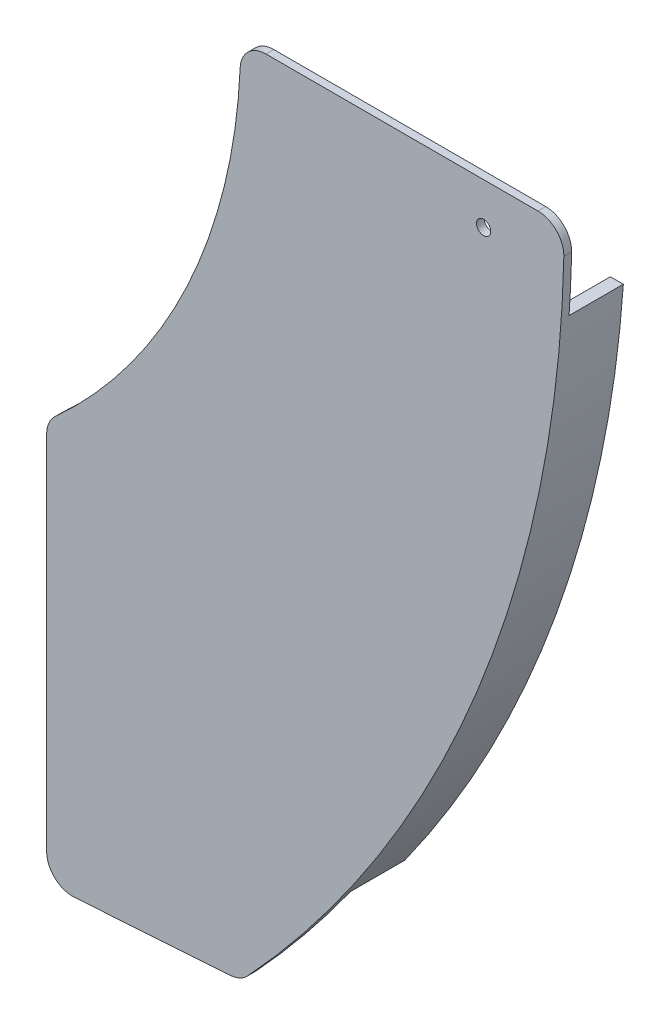
ISO-10303-21;
HEADER;
FILE_DESCRIPTION(('STEP AP214'),'2;1');
FILE_NAME('part.step','',(''),(''),'','','');
FILE_SCHEMA(('AUTOMOTIVE_DESIGN { 1 0 10303 214 1 1 1 1 }'));
ENDSEC;
DATA;
#1=APPLICATION_CONTEXT('core data for automotive mechanical design processes');
#2=APPLICATION_PROTOCOL_DEFINITION('international standard','automotive_design',2000,#1);
#3=PRODUCT_CONTEXT('',#1,'mechanical');
#4=PRODUCT('Part','Part','',(#3));
#5=PRODUCT_RELATED_PRODUCT_CATEGORY('part','',(#4));
#6=PRODUCT_DEFINITION_FORMATION('','',#4);
#7=PRODUCT_DEFINITION_CONTEXT('part definition',#1,'design');
#8=PRODUCT_DEFINITION('design','',#6,#7);
#9=PRODUCT_DEFINITION_SHAPE('','',#8);
#10=(LENGTH_UNIT() NAMED_UNIT(*) SI_UNIT(.MILLI.,.METRE.));
#11=(NAMED_UNIT(*) PLANE_ANGLE_UNIT() SI_UNIT($,.RADIAN.));
#12=(NAMED_UNIT(*) SI_UNIT($,.STERADIAN.) SOLID_ANGLE_UNIT());
#13=UNCERTAINTY_MEASURE_WITH_UNIT(LENGTH_MEASURE(1.E-05),#10,'distance_accuracy_value','');
#14=(GEOMETRIC_REPRESENTATION_CONTEXT(3) GLOBAL_UNCERTAINTY_ASSIGNED_CONTEXT((#13)) GLOBAL_UNIT_ASSIGNED_CONTEXT((#10,
#11,#12)) REPRESENTATION_CONTEXT('',''));
#15=CARTESIAN_POINT('',(0.,0.,0.));
#16=DIRECTION('',(0.,0.,1.));
#17=DIRECTION('',(1.,0.,0.));
#18=AXIS2_PLACEMENT_3D('',#15,#16,#17);
#19=CARTESIAN_POINT('',(114.888726767098,-10.,-1.25));
#20=DIRECTION('',(0.,0.,-1.));
#21=DIRECTION('',(1.,0.,0.));
#22=AXIS2_PLACEMENT_3D('',#19,#20,#21);
#23=CYLINDRICAL_SURFACE('',#22,10.);
#24=DIRECTION('',(0.,0.,-1.));
#25=VECTOR('',#24,1.);
#26=CARTESIAN_POINT('',(124.886250727202,-10.2225189141077,-1.25));
#27=LINE('',#26,#25);
#28=CARTESIAN_POINT('',(124.886250727202,-10.2225189141077,1.75));
#29=VERTEX_POINT('',#28);
#30=CARTESIAN_POINT('',(124.886250727202,-10.2225189141077,-1.25));
#31=VERTEX_POINT('',#30);
#32=EDGE_CURVE('E11',#29,#31,#27,.T.);
#33=ORIENTED_EDGE('',*,*,#32,.T.);
#34=CARTESIAN_POINT('',(114.888726767098,-10.,-1.25));
#35=DIRECTION('',(0.,0.,1.));
#36=DIRECTION('',(-1.,0.,0.));
#37=AXIS2_PLACEMENT_3D('',#34,#35,#36);
#38=CIRCLE('',#37,10.);
#39=CARTESIAN_POINT('',(114.888726767098,0.,-1.25));
#40=VERTEX_POINT('',#39);
#41=EDGE_CURVE('E180',#31,#40,#38,.T.);
#42=ORIENTED_EDGE('',*,*,#41,.T.);
#43=DIRECTION('',(0.,0.,-1.));
#44=VECTOR('',#43,1.);
#45=CARTESIAN_POINT('',(114.888726767098,0.,-1.25));
#46=LINE('',#45,#44);
#47=CARTESIAN_POINT('',(114.888726767098,0.,1.75));
#48=VERTEX_POINT('',#47);
#49=EDGE_CURVE('E48',#48,#40,#46,.T.);
#50=ORIENTED_EDGE('',*,*,#49,.F.);
#51=CARTESIAN_POINT('',(114.888726767098,-10.,1.75));
#52=DIRECTION('',(0.,0.,1.));
#53=DIRECTION('',(1.,0.,0.));
#54=AXIS2_PLACEMENT_3D('',#51,#52,#53);
#55=CIRCLE('',#54,10.);
#56=EDGE_CURVE('E230',#29,#48,#55,.T.);
#57=ORIENTED_EDGE('',*,*,#56,.F.);
#58=EDGE_LOOP('',(#33,#42,#50,#57));
#59=FACE_BOUND('',#58,.T.);
#60=ADVANCED_FACE('F39',(#59),#23,.T.);
#61=CARTESIAN_POINT('',(9.78155520058865,0.,-1.25));
#62=DIRECTION('',(0.,1.,0.));
#63=DIRECTION('',(-1.,0.,0.));
#64=AXIS2_PLACEMENT_3D('',#61,#62,#63);
#65=PLANE('',#64);
#66=ORIENTED_EDGE('',*,*,#49,.T.);
#67=DIRECTION('',(-1.,0.,0.));
#68=VECTOR('',#67,1.);
#69=CARTESIAN_POINT('',(9.78155520058865,0.,-1.25));
#70=LINE('',#69,#68);
#71=CARTESIAN_POINT('',(9.78155520058865,0.,-1.25));
#72=VERTEX_POINT('',#71);
#73=EDGE_CURVE('E183',#40,#72,#70,.T.);
#74=ORIENTED_EDGE('',*,*,#73,.T.);
#75=DIRECTION('',(0.,0.,-1.));
#76=VECTOR('',#75,1.);
#77=CARTESIAN_POINT('',(9.78155520058865,0.,-1.25));
#78=LINE('',#77,#76);
#79=CARTESIAN_POINT('',(9.78155520058865,0.,1.75));
#80=VERTEX_POINT('',#79);
#81=EDGE_CURVE('E252',#80,#72,#78,.T.);
#82=ORIENTED_EDGE('',*,*,#81,.F.);
#83=DIRECTION('',(1.,0.,0.));
#84=VECTOR('',#83,1.);
#85=CARTESIAN_POINT('',(-4.61015868874694,0.,1.75));
#86=LINE('',#85,#84);
#87=EDGE_CURVE('E227',#48,#80,#86,.F.);
#88=ORIENTED_EDGE('',*,*,#87,.F.);
#89=EDGE_LOOP('',(#66,#74,#82,#88));
#90=FACE_BOUND('',#89,.T.);
#91=ADVANCED_FACE('F258',(#90),#65,.T.);
#92=CARTESIAN_POINT('',(9.78155520058865,-10.,-1.25));
#93=DIRECTION('',(0.,0.,-1.));
#94=DIRECTION('',(1.,0.,0.));
#95=AXIS2_PLACEMENT_3D('',#92,#93,#94);
#96=CYLINDRICAL_SURFACE('',#95,10.);
#97=ORIENTED_EDGE('',*,*,#81,.T.);
#98=CARTESIAN_POINT('',(9.78155520058865,-10.,-1.25));
#99=DIRECTION('',(0.,0.,1.));
#100=DIRECTION('',(1.,0.,0.));
#101=AXIS2_PLACEMENT_3D('',#98,#99,#100);
#102=CIRCLE('',#101,10.);
#103=CARTESIAN_POINT('',(-0.208905725201242,-9.56331877729251,-1.25));
#104=VERTEX_POINT('',#103);
#105=EDGE_CURVE('E186',#72,#104,#102,.T.);
#106=ORIENTED_EDGE('',*,*,#105,.T.);
#107=DIRECTION('',(0.,0.,-1.));
#108=VECTOR('',#107,1.);
#109=CARTESIAN_POINT('',(-0.208905725201242,-9.56331877729251,-1.25));
#110=LINE('',#109,#108);
#111=CARTESIAN_POINT('',(-0.208905725201242,-9.5633187772925,1.75));
#112=VERTEX_POINT('',#111);
#113=EDGE_CURVE('E249',#112,#104,#110,.T.);
#114=ORIENTED_EDGE('',*,*,#113,.F.);
#115=CARTESIAN_POINT('',(9.78155520058865,-10.,1.75));
#116=DIRECTION('',(0.,0.,1.));
#117=DIRECTION('',(1.,0.,0.));
#118=AXIS2_PLACEMENT_3D('',#115,#116,#117);
#119=CIRCLE('',#118,10.);
#120=EDGE_CURVE('E224',#80,#112,#119,.T.);
#121=ORIENTED_EDGE('',*,*,#120,.F.);
#122=EDGE_LOOP('',(#97,#106,#114,#121));
#123=FACE_BOUND('',#122,.T.);
#124=ADVANCED_FACE('F270',(#123),#96,.T.);
#125=CARTESIAN_POINT('',(-219.,0.,-1.25));
#126=DIRECTION('',(0.,0.,-1.));
#127=DIRECTION('',(1.,0.,0.));
#128=AXIS2_PLACEMENT_3D('',#125,#126,#127);
#129=CYLINDRICAL_SURFACE('',#128,219.);
#130=ORIENTED_EDGE('',*,*,#113,.T.);
#131=CARTESIAN_POINT('',(-219.,0.,-1.25));
#132=DIRECTION('',(0.,0.,-1.));
#133=DIRECTION('',(-1.,0.,0.));
#134=AXIS2_PLACEMENT_3D('',#131,#132,#133);
#135=CIRCLE('',#134,219.);
#136=CARTESIAN_POINT('',(-71.7248908296944,-162.08344214902,-1.25));
#137=VERTEX_POINT('',#136);
#138=EDGE_CURVE('E189',#104,#137,#135,.T.);
#139=ORIENTED_EDGE('',*,*,#138,.T.);
#140=DIRECTION('',(0.,0.,-1.));
#141=VECTOR('',#140,1.);
#142=CARTESIAN_POINT('',(-71.7248908296944,-162.08344214902,-1.25));
#143=LINE('',#142,#141);
#144=CARTESIAN_POINT('',(-71.7248908296944,-162.08344214902,1.75));
#145=VERTEX_POINT('',#144);
#146=EDGE_CURVE('E246',#145,#137,#143,.T.);
#147=ORIENTED_EDGE('',*,*,#146,.F.);
#148=CARTESIAN_POINT('',(-219.,0.,1.75));
#149=DIRECTION('',(0.,0.,-1.));
#150=DIRECTION('',(-1.,0.,0.));
#151=AXIS2_PLACEMENT_3D('',#148,#149,#150);
#152=CIRCLE('',#151,219.);
#153=EDGE_CURVE('E221',#112,#145,#152,.T.);
#154=ORIENTED_EDGE('',*,*,#153,.F.);
#155=EDGE_LOOP('',(#130,#139,#147,#154));
#156=FACE_BOUND('',#155,.T.);
#157=ADVANCED_FACE('F300',(#156),#129,.F.);
#158=CARTESIAN_POINT('',(-65.,-169.484512566783,-1.25));
#159=DIRECTION('',(0.,0.,-1.));
#160=DIRECTION('',(1.,0.,0.));
#161=AXIS2_PLACEMENT_3D('',#158,#159,#160);
#162=CYLINDRICAL_SURFACE('',#161,9.99999999999999);
#163=ORIENTED_EDGE('',*,*,#146,.T.);
#164=CARTESIAN_POINT('',(-65.,-169.484512566783,-1.25));
#165=DIRECTION('',(0.,0.,1.));
#166=DIRECTION('',(1.,0.,0.));
#167=AXIS2_PLACEMENT_3D('',#164,#165,#166);
#168=CIRCLE('',#167,9.99999999999999);
#169=CARTESIAN_POINT('',(-75.,-169.484512566783,-1.25));
#170=VERTEX_POINT('',#169);
#171=EDGE_CURVE('E192',#137,#170,#168,.T.);
#172=ORIENTED_EDGE('',*,*,#171,.T.);
#173=DIRECTION('',(0.,0.,-1.));
#174=VECTOR('',#173,1.);
#175=CARTESIAN_POINT('',(-75.,-169.484512566783,-1.25));
#176=LINE('',#175,#174);
#177=CARTESIAN_POINT('',(-75.,-169.484512566783,1.75));
#178=VERTEX_POINT('',#177);
#179=EDGE_CURVE('E243',#178,#170,#176,.T.);
#180=ORIENTED_EDGE('',*,*,#179,.F.);
#181=CARTESIAN_POINT('',(-65.,-169.484512566783,1.75));
#182=DIRECTION('',(0.,0.,1.));
#183=DIRECTION('',(1.,0.,0.));
#184=AXIS2_PLACEMENT_3D('',#181,#182,#183);
#185=CIRCLE('',#184,9.99999999999999);
#186=EDGE_CURVE('E218',#145,#178,#185,.T.);
#187=ORIENTED_EDGE('',*,*,#186,.F.);
#188=EDGE_LOOP('',(#163,#172,#180,#187));
#189=FACE_BOUND('',#188,.T.);
#190=ADVANCED_FACE('F297',(#189),#162,.T.);
#191=CARTESIAN_POINT('',(-75.,-169.484512566783,-1.25));
#192=DIRECTION('',(-1.,0.,0.));
#193=DIRECTION('',(0.,-1.,0.));
#194=AXIS2_PLACEMENT_3D('',#191,#192,#193);
#195=PLANE('',#194);
#196=ORIENTED_EDGE('',*,*,#179,.T.);
#197=DIRECTION('',(0.,-1.,0.));
#198=VECTOR('',#197,1.);
#199=CARTESIAN_POINT('',(-75.,-169.484512566783,-1.25));
#200=LINE('',#199,#198);
#201=CARTESIAN_POINT('',(-75.,-309.311135747751,-1.25));
#202=VERTEX_POINT('',#201);
#203=EDGE_CURVE('E195',#170,#202,#200,.T.);
#204=ORIENTED_EDGE('',*,*,#203,.T.);
#205=DIRECTION('',(0.,0.,-1.));
#206=VECTOR('',#205,1.);
#207=CARTESIAN_POINT('',(-75.,-309.311135747751,-1.25));
#208=LINE('',#207,#206);
#209=CARTESIAN_POINT('',(-75.,-309.311135747751,1.75));
#210=VERTEX_POINT('',#209);
#211=EDGE_CURVE('E240',#210,#202,#208,.T.);
#212=ORIENTED_EDGE('',*,*,#211,.F.);
#213=DIRECTION('',(0.,1.,0.));
#214=VECTOR('',#213,1.);
#215=CARTESIAN_POINT('',(-75.,-305.285146327001,1.75));
#216=LINE('',#215,#214);
#217=EDGE_CURVE('E215',#178,#210,#216,.F.);
#218=ORIENTED_EDGE('',*,*,#217,.F.);
#219=EDGE_LOOP('',(#196,#204,#212,#218));
#220=FACE_BOUND('',#219,.T.);
#221=ADVANCED_FACE('F295',(#220),#195,.T.);
#222=CARTESIAN_POINT('',(-65.,-309.311135747751,-1.25));
#223=DIRECTION('',(0.,0.,-1.));
#224=DIRECTION('',(1.,0.,0.));
#225=AXIS2_PLACEMENT_3D('',#222,#223,#224);
#226=CYLINDRICAL_SURFACE('',#225,10.);
#227=ORIENTED_EDGE('',*,*,#211,.T.);
#228=CARTESIAN_POINT('',(-65.,-309.311135747751,-1.25));
#229=DIRECTION('',(0.,0.,1.));
#230=DIRECTION('',(1.,0.,0.));
#231=AXIS2_PLACEMENT_3D('',#228,#229,#230);
#232=CIRCLE('',#231,10.);
#233=CARTESIAN_POINT('',(-64.3348098947622,-319.288987326318,-1.25));
#234=VERTEX_POINT('',#233);
#235=EDGE_CURVE('E198',#202,#234,#232,.T.);
#236=ORIENTED_EDGE('',*,*,#235,.T.);
#237=DIRECTION('',(0.,0.,-1.));
#238=VECTOR('',#237,1.);
#239=CARTESIAN_POINT('',(-64.3348098947622,-319.288987326318,-1.25));
#240=LINE('',#239,#238);
#241=CARTESIAN_POINT('',(-64.3348098947622,-319.288987326318,1.75));
#242=VERTEX_POINT('',#241);
#243=EDGE_CURVE('E237',#242,#234,#240,.T.);
#244=ORIENTED_EDGE('',*,*,#243,.F.);
#245=CARTESIAN_POINT('',(-65.,-309.311135747751,1.75));
#246=DIRECTION('',(0.,0.,1.));
#247=DIRECTION('',(1.,0.,0.));
#248=AXIS2_PLACEMENT_3D('',#245,#246,#247);
#249=CIRCLE('',#248,10.);
#250=EDGE_CURVE('E212',#210,#242,#249,.T.);
#251=ORIENTED_EDGE('',*,*,#250,.F.);
#252=EDGE_LOOP('',(#227,#236,#244,#251));
#253=FACE_BOUND('',#252,.T.);
#254=ADVANCED_FACE('F291',(#253),#226,.T.);
#255=CARTESIAN_POINT('',(-64.3348098947622,-319.288987326318,-1.25));
#256=DIRECTION('',(0.0665190105237743,-0.997785157856609,0.));
#257=DIRECTION('',(0.997785157856609,0.0665190105237743,0.));
#258=AXIS2_PLACEMENT_3D('',#255,#256,#257);
#259=PLANE('',#258);
#260=ORIENTED_EDGE('',*,*,#243,.T.);
#261=DIRECTION('',(0.997785157856609,0.0665190105237743,0.));
#262=VECTOR('',#261,1.);
#263=CARTESIAN_POINT('',(-64.3348098947622,-319.288987326318,-1.25));
#264=LINE('',#263,#262);
#265=CARTESIAN_POINT('',(-3.9449685835092,-315.262997905567,-1.25));
#266=VERTEX_POINT('',#265);
#267=EDGE_CURVE('E201',#234,#266,#264,.T.);
#268=ORIENTED_EDGE('',*,*,#267,.T.);
#269=DIRECTION('',(0.,0.,-1.));
#270=VECTOR('',#269,1.);
#271=CARTESIAN_POINT('',(-3.9449685835092,-315.262997905567,-1.25));
#272=LINE('',#271,#270);
#273=CARTESIAN_POINT('',(-3.9449685835092,-315.262997905567,1.75));
#274=VERTEX_POINT('',#273);
#275=EDGE_CURVE('E234',#274,#266,#272,.T.);
#276=ORIENTED_EDGE('',*,*,#275,.F.);
#277=DIRECTION('',(0.997785157856609,0.0665190105237743,0.));
#278=VECTOR('',#277,1.);
#279=CARTESIAN_POINT('',(-64.3348098947622,-319.288987326318,1.75));
#280=LINE('',#279,#278);
#281=EDGE_CURVE('E173',#242,#274,#280,.T.);
#282=ORIENTED_EDGE('',*,*,#281,.F.);
#283=EDGE_LOOP('',(#260,#268,#276,#282));
#284=FACE_BOUND('',#283,.T.);
#285=ADVANCED_FACE('F288',(#284),#259,.T.);
#286=CARTESIAN_POINT('',(-4.61015868874694,-305.285146327001,-1.25));
#287=DIRECTION('',(0.,0.,-1.));
#288=DIRECTION('',(1.,0.,0.));
#289=AXIS2_PLACEMENT_3D('',#286,#287,#288);
#290=CYLINDRICAL_SURFACE('',#289,9.99999999999996);
#291=ORIENTED_EDGE('',*,*,#275,.T.);
#292=CARTESIAN_POINT('',(-4.61015868874694,-305.285146327001,-1.25));
#293=DIRECTION('',(0.,0.,1.));
#294=DIRECTION('',(1.,0.,0.));
#295=AXIS2_PLACEMENT_3D('',#292,#293,#294);
#296=CIRCLE('',#295,9.99999999999996);
#297=CARTESIAN_POINT('',(2.72828904848621,-312.07831825239,-1.25));
#298=VERTEX_POINT('',#297);
#299=EDGE_CURVE('E172',#266,#298,#296,.T.);
#300=ORIENTED_EDGE('',*,*,#299,.T.);
#301=DIRECTION('',(0.,0.,-1.));
#302=VECTOR('',#301,1.);
#303=CARTESIAN_POINT('',(2.72828904848621,-312.07831825239,-1.25));
#304=LINE('',#303,#302);
#305=CARTESIAN_POINT('',(2.72828904848621,-312.07831825239,1.75));
#306=VERTEX_POINT('',#305);
#307=EDGE_CURVE('E43',#306,#298,#304,.T.);
#308=ORIENTED_EDGE('',*,*,#307,.F.);
#309=CARTESIAN_POINT('',(-4.61015868874694,-305.285146327001,1.75));
#310=DIRECTION('',(0.,0.,1.));
#311=DIRECTION('',(1.,0.,0.));
#312=AXIS2_PLACEMENT_3D('',#309,#310,#311);
#313=CIRCLE('',#312,9.99999999999996);
#314=EDGE_CURVE('E206',#274,#306,#313,.T.);
#315=ORIENTED_EDGE('',*,*,#314,.F.);
#316=EDGE_LOOP('',(#291,#300,#308,#315));
#317=FACE_BOUND('',#316,.T.);
#318=ADVANCED_FACE('F286',(#317),#290,.T.);
#319=CARTESIAN_POINT('',(93.8862507272025,-16.,-1.25));
#320=DIRECTION('',(0.,0.,-1.));
#321=DIRECTION('',(1.,0.,0.));
#322=AXIS2_PLACEMENT_3D('',#319,#320,#321);
#323=CYLINDRICAL_SURFACE('',#322,2.75000000000001);
#324=CARTESIAN_POINT('',(93.8862507272025,-16.,-1.25));
#325=DIRECTION('',(0.,0.,1.));
#326=DIRECTION('',(1.,0.,0.));
#327=AXIS2_PLACEMENT_3D('',#324,#325,#326);
#328=CIRCLE('',#327,2.75000000000001);
#329=CARTESIAN_POINT('',(96.6362507272025,-16.,-1.25));
#330=VERTEX_POINT('',#329);
#331=EDGE_CURVE('E169',#330,#330,#328,.T.);
#332=ORIENTED_EDGE('',*,*,#331,.F.);
#333=EDGE_LOOP('',(#332));
#334=FACE_BOUND('',#333,.T.);
#335=CARTESIAN_POINT('',(93.8862507272025,-16.,1.75));
#336=DIRECTION('',(0.,0.,1.));
#337=DIRECTION('',(1.,0.,0.));
#338=AXIS2_PLACEMENT_3D('',#335,#336,#337);
#339=CIRCLE('',#338,2.75000000000001);
#340=CARTESIAN_POINT('',(96.6362507272025,-16.,1.75));
#341=VERTEX_POINT('',#340);
#342=EDGE_CURVE('E168',#341,#341,#339,.T.);
#343=ORIENTED_EDGE('',*,*,#342,.T.);
#344=EDGE_LOOP('',(#343));
#345=FACE_BOUND('',#344,.T.);
#346=ADVANCED_FACE('F370',(#334,#345),#323,.F.);
#347=CARTESIAN_POINT('',(-334.4,0.,-1.25));
#348=DIRECTION('',(0.,0.,-1.));
#349=DIRECTION('',(1.,0.,0.));
#350=AXIS2_PLACEMENT_3D('',#347,#348,#349);
#351=CYLINDRICAL_SURFACE('',#350,459.4);
#352=CARTESIAN_POINT('',(-334.4,0.,-1.25));
#353=DIRECTION('',(0.,0.,1.));
#354=DIRECTION('',(-1.,0.,0.));
#355=AXIS2_PLACEMENT_3D('',#352,#353,#354);
#356=CIRCLE('',#355,459.4);
#357=CARTESIAN_POINT('',(123.88414766387,-32.,-1.25));
#358=VERTEX_POINT('',#357);
#359=EDGE_CURVE('E176',#358,#31,#356,.T.);
#360=ORIENTED_EDGE('',*,*,#359,.T.);
#361=ORIENTED_EDGE('',*,*,#32,.F.);
#362=CARTESIAN_POINT('',(-334.4,0.,1.75));
#363=DIRECTION('',(0.,0.,1.));
#364=DIRECTION('',(1.,0.,0.));
#365=AXIS2_PLACEMENT_3D('',#362,#363,#364);
#366=CIRCLE('',#365,459.4);
#367=EDGE_CURVE('E209',#306,#29,#366,.T.);
#368=ORIENTED_EDGE('',*,*,#367,.F.);
#369=ORIENTED_EDGE('',*,*,#307,.T.);
#370=CARTESIAN_POINT('',(39.4440316495638,-267.,-1.25));
#371=VERTEX_POINT('',#370);
#372=EDGE_CURVE('E177',#298,#371,#356,.T.);
#373=ORIENTED_EDGE('',*,*,#372,.T.);
#374=DIRECTION('',(0.,0.,1.));
#375=VECTOR('',#374,1.);
#376=CARTESIAN_POINT('',(39.4440316495637,-267.,-22.25));
#377=LINE('',#376,#375);
#378=CARTESIAN_POINT('',(39.4440316495637,-267.,-22.25));
#379=VERTEX_POINT('',#378);
#380=EDGE_CURVE('E159',#379,#371,#377,.T.);
#381=ORIENTED_EDGE('',*,*,#380,.F.);
#382=CARTESIAN_POINT('',(-334.4,0.,-22.25));
#383=DIRECTION('',(0.,0.,-1.));
#384=DIRECTION('',(-1.,0.,0.));
#385=AXIS2_PLACEMENT_3D('',#382,#383,#384);
#386=CIRCLE('',#385,459.4);
#387=CARTESIAN_POINT('',(123.88414766387,-32.,-22.25));
#388=VERTEX_POINT('',#387);
#389=EDGE_CURVE('E150',#388,#379,#386,.T.);
#390=ORIENTED_EDGE('',*,*,#389,.F.);
#391=DIRECTION('',(0.,0.,1.));
#392=VECTOR('',#391,1.);
#393=CARTESIAN_POINT('',(123.88414766387,-32.,-22.25));
#394=LINE('',#393,#392);
#395=EDGE_CURVE('E146',#388,#358,#394,.T.);
#396=ORIENTED_EDGE('',*,*,#395,.T.);
#397=EDGE_LOOP('',(#360,#361,#368,#369,#373,#381,#390,#396));
#398=FACE_BOUND('',#397,.T.);
#399=ADVANCED_FACE('F41',(#398),#351,.T.);
#400=CARTESIAN_POINT('',(-4.61015868874694,-305.285146327001,-1.25));
#401=DIRECTION('',(0.,0.,-1.));
#402=DIRECTION('',(1.,0.,0.));
#403=AXIS2_PLACEMENT_3D('',#400,#401,#402);
#404=PLANE('',#403);
#405=DIRECTION('',(1.,0.,0.));
#406=VECTOR('',#405,1.);
#407=CARTESIAN_POINT('',(-4.61015868874694,-267.,-1.25));
#408=LINE('',#407,#406);
#409=CARTESIAN_POINT('',(33.2824173114619,-267.,-1.25));
#410=VERTEX_POINT('',#409);
#411=EDGE_CURVE('E165',#410,#371,#408,.T.);
#412=ORIENTED_EDGE('',*,*,#411,.T.);
#413=ORIENTED_EDGE('',*,*,#372,.F.);
#414=ORIENTED_EDGE('',*,*,#299,.F.);
#415=ORIENTED_EDGE('',*,*,#267,.F.);
#416=ORIENTED_EDGE('',*,*,#235,.F.);
#417=ORIENTED_EDGE('',*,*,#203,.F.);
#418=ORIENTED_EDGE('',*,*,#171,.F.);
#419=ORIENTED_EDGE('',*,*,#138,.F.);
#420=ORIENTED_EDGE('',*,*,#105,.F.);
#421=ORIENTED_EDGE('',*,*,#73,.F.);
#422=ORIENTED_EDGE('',*,*,#41,.F.);
#423=ORIENTED_EDGE('',*,*,#359,.F.);
#424=DIRECTION('',(-1.,0.,0.));
#425=VECTOR('',#424,1.);
#426=CARTESIAN_POINT('',(-4.61015868874694,-32.,-1.25));
#427=LINE('',#426,#425);
#428=CARTESIAN_POINT('',(118.87183896642,-32.,-1.25));
#429=VERTEX_POINT('',#428);
#430=EDGE_CURVE('E63',#358,#429,#427,.T.);
#431=ORIENTED_EDGE('',*,*,#430,.T.);
#432=CARTESIAN_POINT('',(-334.4,0.,-1.25));
#433=DIRECTION('',(0.,0.,1.));
#434=DIRECTION('',(1.,0.,0.));
#435=AXIS2_PLACEMENT_3D('',#432,#433,#434);
#436=CIRCLE('',#435,454.4);
#437=EDGE_CURVE('E157',#429,#410,#436,.F.);
#438=ORIENTED_EDGE('',*,*,#437,.T.);
#439=EDGE_LOOP('',(#412,#413,#414,#415,#416,#417,#418,#419,#420,#421,#422,#423,#431,#438));
#440=FACE_BOUND('',#439,.T.);
#441=ORIENTED_EDGE('',*,*,#331,.T.);
#442=EDGE_LOOP('',(#441));
#443=FACE_BOUND('',#442,.T.);
#444=ADVANCED_FACE('F266',(#440,#443),#404,.T.);
#445=CARTESIAN_POINT('',(-4.61015868874694,-305.285146327001,1.75));
#446=DIRECTION('',(0.,0.,-1.));
#447=DIRECTION('',(1.,0.,0.));
#448=AXIS2_PLACEMENT_3D('',#445,#446,#447);
#449=PLANE('',#448);
#450=ORIENTED_EDGE('',*,*,#56,.T.);
#451=ORIENTED_EDGE('',*,*,#87,.T.);
#452=ORIENTED_EDGE('',*,*,#120,.T.);
#453=ORIENTED_EDGE('',*,*,#153,.T.);
#454=ORIENTED_EDGE('',*,*,#186,.T.);
#455=ORIENTED_EDGE('',*,*,#217,.T.);
#456=ORIENTED_EDGE('',*,*,#250,.T.);
#457=ORIENTED_EDGE('',*,*,#281,.T.);
#458=ORIENTED_EDGE('',*,*,#314,.T.);
#459=ORIENTED_EDGE('',*,*,#367,.T.);
#460=EDGE_LOOP('',(#450,#451,#452,#453,#454,#455,#456,#457,#458,#459));
#461=FACE_BOUND('',#460,.T.);
#462=ORIENTED_EDGE('',*,*,#342,.F.);
#463=EDGE_LOOP('',(#462));
#464=FACE_BOUND('',#463,.T.);
#465=ADVANCED_FACE('F272',(#461,#464),#449,.F.);
#466=CARTESIAN_POINT('',(-334.4,0.,-22.25));
#467=DIRECTION('',(0.,0.,1.));
#468=DIRECTION('',(-1.,0.,0.));
#469=AXIS2_PLACEMENT_3D('',#466,#467,#468);
#470=CYLINDRICAL_SURFACE('',#469,454.4);
#471=DIRECTION('',(0.,0.,1.));
#472=VECTOR('',#471,1.);
#473=CARTESIAN_POINT('',(118.87183896642,-32.,-22.25));
#474=LINE('',#473,#472);
#475=CARTESIAN_POINT('',(118.87183896642,-32.,-22.25));
#476=VERTEX_POINT('',#475);
#477=EDGE_CURVE('E145',#476,#429,#474,.T.);
#478=ORIENTED_EDGE('',*,*,#477,.F.);
#479=CARTESIAN_POINT('',(-334.4,0.,-22.25));
#480=DIRECTION('',(0.,0.,1.));
#481=DIRECTION('',(-1.,0.,0.));
#482=AXIS2_PLACEMENT_3D('',#479,#480,#481);
#483=CIRCLE('',#482,454.4);
#484=CARTESIAN_POINT('',(33.2824173114618,-267.,-22.25));
#485=VERTEX_POINT('',#484);
#486=EDGE_CURVE('E151',#485,#476,#483,.T.);
#487=ORIENTED_EDGE('',*,*,#486,.F.);
#488=DIRECTION('',(0.,0.,1.));
#489=VECTOR('',#488,1.);
#490=CARTESIAN_POINT('',(33.2824173114618,-267.,-22.25));
#491=LINE('',#490,#489);
#492=EDGE_CURVE('E55',#485,#410,#491,.T.);
#493=ORIENTED_EDGE('',*,*,#492,.T.);
#494=ORIENTED_EDGE('',*,*,#437,.F.);
#495=EDGE_LOOP('',(#478,#487,#493,#494));
#496=FACE_BOUND('',#495,.T.);
#497=ADVANCED_FACE('F156',(#496),#470,.F.);
#498=CARTESIAN_POINT('',(33.2824173114618,-267.,-22.25));
#499=DIRECTION('',(0.,-1.,0.));
#500=DIRECTION('',(0.,0.,1.));
#501=AXIS2_PLACEMENT_3D('',#498,#499,#500);
#502=PLANE('',#501);
#503=ORIENTED_EDGE('',*,*,#492,.F.);
#504=DIRECTION('',(-1.,0.,0.));
#505=VECTOR('',#504,1.);
#506=CARTESIAN_POINT('',(33.2824173114618,-267.,-22.25));
#507=LINE('',#506,#505);
#508=EDGE_CURVE('E154',#379,#485,#507,.T.);
#509=ORIENTED_EDGE('',*,*,#508,.F.);
#510=ORIENTED_EDGE('',*,*,#380,.T.);
#511=ORIENTED_EDGE('',*,*,#411,.F.);
#512=EDGE_LOOP('',(#503,#509,#510,#511));
#513=FACE_BOUND('',#512,.T.);
#514=ADVANCED_FACE('F282',(#513),#502,.T.);
#515=CARTESIAN_POINT('',(118.87183896642,-32.,-22.25));
#516=DIRECTION('',(0.,1.,0.));
#517=DIRECTION('',(0.,0.,-1.));
#518=AXIS2_PLACEMENT_3D('',#515,#516,#517);
#519=PLANE('',#518);
#520=ORIENTED_EDGE('',*,*,#395,.F.);
#521=DIRECTION('',(1.,0.,0.));
#522=VECTOR('',#521,1.);
#523=CARTESIAN_POINT('',(118.87183896642,-32.,-22.25));
#524=LINE('',#523,#522);
#525=EDGE_CURVE('E141',#476,#388,#524,.T.);
#526=ORIENTED_EDGE('',*,*,#525,.F.);
#527=ORIENTED_EDGE('',*,*,#477,.T.);
#528=ORIENTED_EDGE('',*,*,#430,.F.);
#529=EDGE_LOOP('',(#520,#526,#527,#528));
#530=FACE_BOUND('',#529,.T.);
#531=ADVANCED_FACE('F143',(#530),#519,.T.);
#532=CARTESIAN_POINT('',(-334.4,0.,-22.25));
#533=DIRECTION('',(0.,0.,1.));
#534=DIRECTION('',(-1.,0.,0.));
#535=AXIS2_PLACEMENT_3D('',#532,#533,#534);
#536=PLANE('',#535);
#537=ORIENTED_EDGE('',*,*,#486,.T.);
#538=ORIENTED_EDGE('',*,*,#525,.T.);
#539=ORIENTED_EDGE('',*,*,#389,.T.);
#540=ORIENTED_EDGE('',*,*,#508,.T.);
#541=EDGE_LOOP('',(#537,#538,#539,#540));
#542=FACE_BOUND('',#541,.T.);
#543=ADVANCED_FACE('F153',(#542),#536,.F.);
#544=CLOSED_SHELL('',(#60,#91,#124,#157,#190,#221,#254,#285,#318,#346,#399,#444,#465,#497,#514,
#531,#543));
#545=MANIFOLD_SOLID_BREP('B2',#544);
#546=ADVANCED_BREP_SHAPE_REPRESENTATION('',(#18,#545),#14);
#547=SHAPE_DEFINITION_REPRESENTATION(#9,#546);
ENDSEC;
END-ISO-10303-21;
